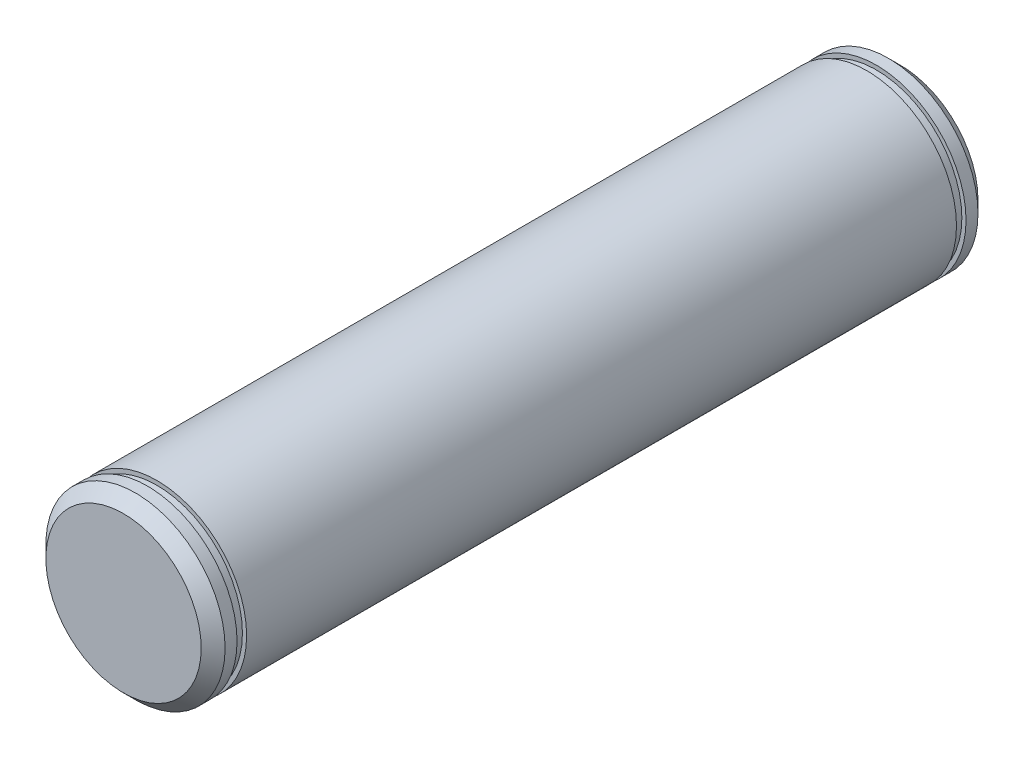
ISO-10303-21;
HEADER;
FILE_DESCRIPTION(('STEP AP214'),'2;1');
FILE_NAME('part.step','',(''),(''),'','','');
FILE_SCHEMA(('AUTOMOTIVE_DESIGN { 1 0 10303 214 1 1 1 1 }'));
ENDSEC;
DATA;
#1=APPLICATION_CONTEXT('core data for automotive mechanical design processes');
#2=APPLICATION_PROTOCOL_DEFINITION('international standard','automotive_design',2000,#1);
#3=PRODUCT_CONTEXT('',#1,'mechanical');
#4=PRODUCT('Part','Part','',(#3));
#5=PRODUCT_RELATED_PRODUCT_CATEGORY('part','',(#4));
#6=PRODUCT_DEFINITION_FORMATION('','',#4);
#7=PRODUCT_DEFINITION_CONTEXT('part definition',#1,'design');
#8=PRODUCT_DEFINITION('design','',#6,#7);
#9=PRODUCT_DEFINITION_SHAPE('','',#8);
#10=(LENGTH_UNIT() NAMED_UNIT(*) SI_UNIT(.MILLI.,.METRE.));
#11=(NAMED_UNIT(*) PLANE_ANGLE_UNIT() SI_UNIT($,.RADIAN.));
#12=(NAMED_UNIT(*) SI_UNIT($,.STERADIAN.) SOLID_ANGLE_UNIT());
#13=UNCERTAINTY_MEASURE_WITH_UNIT(LENGTH_MEASURE(1.E-05),#10,'distance_accuracy_value','');
#14=(GEOMETRIC_REPRESENTATION_CONTEXT(3) GLOBAL_UNCERTAINTY_ASSIGNED_CONTEXT((#13)) GLOBAL_UNIT_ASSIGNED_CONTEXT((#10,
#11,#12)) REPRESENTATION_CONTEXT('',''));
#15=CARTESIAN_POINT('',(0.,0.,0.));
#16=DIRECTION('',(0.,0.,1.));
#17=DIRECTION('',(1.,0.,0.));
#18=AXIS2_PLACEMENT_3D('',#15,#16,#17);
#19=CARTESIAN_POINT('',(0.,0.,130.));
#20=DIRECTION('',(0.,0.,-1.));
#21=DIRECTION('',(-1.,0.,0.));
#22=AXIS2_PLACEMENT_3D('',#19,#20,#21);
#23=CYLINDRICAL_SURFACE('',#22,15.);
#24=CARTESIAN_POINT('',(0.,0.,128.));
#25=DIRECTION('',(0.,0.,1.));
#26=DIRECTION('',(1.,0.,0.));
#27=AXIS2_PLACEMENT_3D('',#24,#25,#26);
#28=CIRCLE('',#27,15.);
#29=CARTESIAN_POINT('',(15.,0.,128.));
#30=VERTEX_POINT('',#29);
#31=EDGE_CURVE('E50',#30,#30,#28,.F.);
#32=ORIENTED_EDGE('',*,*,#31,.T.);
#33=EDGE_LOOP('',(#32));
#34=FACE_BOUND('',#33,.T.);
#35=CARTESIAN_POINT('',(0.,0.,126.));
#36=DIRECTION('',(0.,0.,1.));
#37=DIRECTION('',(1.,0.,0.));
#38=AXIS2_PLACEMENT_3D('',#35,#36,#37);
#39=CIRCLE('',#38,15.);
#40=CARTESIAN_POINT('',(15.,0.,126.));
#41=VERTEX_POINT('',#40);
#42=EDGE_CURVE('E59',#41,#41,#39,.T.);
#43=ORIENTED_EDGE('',*,*,#42,.T.);
#44=EDGE_LOOP('',(#43));
#45=FACE_BOUND('',#44,.T.);
#46=ADVANCED_FACE('F35',(#34,#45),#23,.T.);
#47=CARTESIAN_POINT('',(0.,0.,130.));
#48=DIRECTION('',(0.,0.,1.));
#49=DIRECTION('',(1.,0.,0.));
#50=AXIS2_PLACEMENT_3D('',#47,#48,#49);
#51=PLANE('',#50);
#52=CARTESIAN_POINT('',(0.,0.,130.));
#53=DIRECTION('',(0.,0.,1.));
#54=DIRECTION('',(1.,0.,0.));
#55=AXIS2_PLACEMENT_3D('',#52,#53,#54);
#56=CIRCLE('',#55,13.);
#57=CARTESIAN_POINT('',(13.,0.,130.));
#58=VERTEX_POINT('',#57);
#59=EDGE_CURVE('E10',#58,#58,#56,.T.);
#60=ORIENTED_EDGE('',*,*,#59,.T.);
#61=EDGE_LOOP('',(#60));
#62=FACE_BOUND('',#61,.T.);
#63=ADVANCED_FACE('F93',(#62),#51,.T.);
#64=CARTESIAN_POINT('',(0.,0.,130.));
#65=DIRECTION('',(0.,0.,-1.));
#66=DIRECTION('',(-1.,0.,0.));
#67=AXIS2_PLACEMENT_3D('',#64,#65,#66);
#68=CONICAL_SURFACE('',#67,13.,0.785398163397442);
#69=ORIENTED_EDGE('',*,*,#31,.F.);
#70=EDGE_LOOP('',(#69));
#71=FACE_BOUND('',#70,.T.);
#72=ORIENTED_EDGE('',*,*,#59,.F.);
#73=EDGE_LOOP('',(#72));
#74=FACE_BOUND('',#73,.T.);
#75=ADVANCED_FACE('F37',(#71,#74),#68,.T.);
#76=CARTESIAN_POINT('',(0.,15.,126.));
#77=DIRECTION('',(0.,0.,-1.));
#78=DIRECTION('',(-1.,0.,0.));
#79=AXIS2_PLACEMENT_3D('',#76,#77,#78);
#80=PLANE('',#79);
#81=CARTESIAN_POINT('',(0.,0.,126.));
#82=DIRECTION('',(0.,0.,1.));
#83=DIRECTION('',(1.,0.,0.));
#84=AXIS2_PLACEMENT_3D('',#81,#82,#83);
#85=CIRCLE('',#84,14.3);
#86=CARTESIAN_POINT('',(14.3,0.,126.));
#87=VERTEX_POINT('',#86);
#88=EDGE_CURVE('E55',#87,#87,#85,.T.);
#89=ORIENTED_EDGE('',*,*,#88,.T.);
#90=EDGE_LOOP('',(#89));
#91=FACE_BOUND('',#90,.T.);
#92=ORIENTED_EDGE('',*,*,#42,.F.);
#93=EDGE_LOOP('',(#92));
#94=FACE_BOUND('',#93,.T.);
#95=ADVANCED_FACE('F81',(#91,#94),#80,.T.);
#96=CARTESIAN_POINT('',(0.,0.,130.));
#97=DIRECTION('',(0.,0.,1.));
#98=DIRECTION('',(1.,0.,0.));
#99=AXIS2_PLACEMENT_3D('',#96,#97,#98);
#100=CYLINDRICAL_SURFACE('',#99,14.3);
#101=CARTESIAN_POINT('',(0.,0.,124.4));
#102=DIRECTION('',(0.,0.,1.));
#103=DIRECTION('',(1.,0.,0.));
#104=AXIS2_PLACEMENT_3D('',#101,#102,#103);
#105=CIRCLE('',#104,14.3);
#106=CARTESIAN_POINT('',(14.3,0.,124.4));
#107=VERTEX_POINT('',#106);
#108=EDGE_CURVE('E71',#107,#107,#105,.T.);
#109=ORIENTED_EDGE('',*,*,#108,.T.);
#110=EDGE_LOOP('',(#109));
#111=FACE_BOUND('',#110,.T.);
#112=ORIENTED_EDGE('',*,*,#88,.F.);
#113=EDGE_LOOP('',(#112));
#114=FACE_BOUND('',#113,.T.);
#115=ADVANCED_FACE('F83',(#111,#114),#100,.T.);
#116=CARTESIAN_POINT('',(0.,15.,124.4));
#117=DIRECTION('',(0.,0.,1.));
#118=DIRECTION('',(1.,0.,0.));
#119=AXIS2_PLACEMENT_3D('',#116,#117,#118);
#120=PLANE('',#119);
#121=CARTESIAN_POINT('',(0.,0.,124.4));
#122=DIRECTION('',(0.,0.,1.));
#123=DIRECTION('',(1.,0.,0.));
#124=AXIS2_PLACEMENT_3D('',#121,#122,#123);
#125=CIRCLE('',#124,15.);
#126=CARTESIAN_POINT('',(15.,0.,124.4));
#127=VERTEX_POINT('',#126);
#128=EDGE_CURVE('E74',#127,#127,#125,.T.);
#129=ORIENTED_EDGE('',*,*,#128,.T.);
#130=EDGE_LOOP('',(#129));
#131=FACE_BOUND('',#130,.T.);
#132=ORIENTED_EDGE('',*,*,#108,.F.);
#133=EDGE_LOOP('',(#132));
#134=FACE_BOUND('',#133,.T.);
#135=ADVANCED_FACE('F90',(#131,#134),#120,.T.);
#136=CARTESIAN_POINT('',(0.,0.,5.59999999999999));
#137=DIRECTION('',(0.,0.,1.));
#138=DIRECTION('',(1.,0.,0.));
#139=AXIS2_PLACEMENT_3D('',#136,#137,#138);
#140=CIRCLE('',#139,15.);
#141=CARTESIAN_POINT('',(15.,0.,5.59999999999999));
#142=VERTEX_POINT('',#141);
#143=EDGE_CURVE('E66',#142,#142,#140,.T.);
#144=ORIENTED_EDGE('',*,*,#143,.T.);
#145=EDGE_LOOP('',(#144));
#146=FACE_BOUND('',#145,.T.);
#147=ORIENTED_EDGE('',*,*,#128,.F.);
#148=EDGE_LOOP('',(#147));
#149=FACE_BOUND('',#148,.T.);
#150=ADVANCED_FACE('F99',(#146,#149),#23,.T.);
#151=CARTESIAN_POINT('',(0.,15.,5.6));
#152=DIRECTION('',(0.,0.,-1.));
#153=DIRECTION('',(-1.,0.,0.));
#154=AXIS2_PLACEMENT_3D('',#151,#152,#153);
#155=PLANE('',#154);
#156=CARTESIAN_POINT('',(0.,0.,5.59999999999999));
#157=DIRECTION('',(0.,0.,1.));
#158=DIRECTION('',(1.,0.,0.));
#159=AXIS2_PLACEMENT_3D('',#156,#157,#158);
#160=CIRCLE('',#159,14.3);
#161=CARTESIAN_POINT('',(14.3,0.,5.59999999999999));
#162=VERTEX_POINT('',#161);
#163=EDGE_CURVE('E56',#162,#162,#160,.T.);
#164=ORIENTED_EDGE('',*,*,#163,.T.);
#165=EDGE_LOOP('',(#164));
#166=FACE_BOUND('',#165,.T.);
#167=ORIENTED_EDGE('',*,*,#143,.F.);
#168=EDGE_LOOP('',(#167));
#169=FACE_BOUND('',#168,.T.);
#170=ADVANCED_FACE('F107',(#166,#169),#155,.T.);
#171=CARTESIAN_POINT('',(0.,0.,130.));
#172=DIRECTION('',(0.,0.,1.));
#173=DIRECTION('',(1.,0.,0.));
#174=AXIS2_PLACEMENT_3D('',#171,#172,#173);
#175=CYLINDRICAL_SURFACE('',#174,14.3);
#176=CARTESIAN_POINT('',(0.,0.,4.));
#177=DIRECTION('',(0.,0.,1.));
#178=DIRECTION('',(1.,0.,0.));
#179=AXIS2_PLACEMENT_3D('',#176,#177,#178);
#180=CIRCLE('',#179,14.3);
#181=CARTESIAN_POINT('',(14.3,0.,4.));
#182=VERTEX_POINT('',#181);
#183=EDGE_CURVE('E60',#182,#182,#180,.T.);
#184=ORIENTED_EDGE('',*,*,#183,.T.);
#185=EDGE_LOOP('',(#184));
#186=FACE_BOUND('',#185,.T.);
#187=ORIENTED_EDGE('',*,*,#163,.F.);
#188=EDGE_LOOP('',(#187));
#189=FACE_BOUND('',#188,.T.);
#190=ADVANCED_FACE('F124',(#186,#189),#175,.T.);
#191=CARTESIAN_POINT('',(0.,15.,4.));
#192=DIRECTION('',(0.,0.,1.));
#193=DIRECTION('',(1.,0.,0.));
#194=AXIS2_PLACEMENT_3D('',#191,#192,#193);
#195=PLANE('',#194);
#196=CARTESIAN_POINT('',(0.,0.,4.));
#197=DIRECTION('',(0.,0.,1.));
#198=DIRECTION('',(1.,0.,0.));
#199=AXIS2_PLACEMENT_3D('',#196,#197,#198);
#200=CIRCLE('',#199,15.);
#201=CARTESIAN_POINT('',(15.,0.,4.));
#202=VERTEX_POINT('',#201);
#203=EDGE_CURVE('E63',#202,#202,#200,.T.);
#204=ORIENTED_EDGE('',*,*,#203,.T.);
#205=EDGE_LOOP('',(#204));
#206=FACE_BOUND('',#205,.T.);
#207=ORIENTED_EDGE('',*,*,#183,.F.);
#208=EDGE_LOOP('',(#207));
#209=FACE_BOUND('',#208,.T.);
#210=ADVANCED_FACE('F121',(#206,#209),#195,.T.);
#211=CARTESIAN_POINT('',(0.,0.,0.));
#212=DIRECTION('',(0.,0.,1.));
#213=DIRECTION('',(1.,0.,0.));
#214=AXIS2_PLACEMENT_3D('',#211,#212,#213);
#215=PLANE('',#214);
#216=CARTESIAN_POINT('',(0.,0.,0.));
#217=DIRECTION('',(0.,0.,1.));
#218=DIRECTION('',(1.,0.,0.));
#219=AXIS2_PLACEMENT_3D('',#216,#217,#218);
#220=CIRCLE('',#219,13.);
#221=CARTESIAN_POINT('',(13.,0.,0.));
#222=VERTEX_POINT('',#221);
#223=EDGE_CURVE('E42',#222,#222,#220,.F.);
#224=ORIENTED_EDGE('',*,*,#223,.T.);
#225=EDGE_LOOP('',(#224));
#226=FACE_BOUND('',#225,.T.);
#227=ADVANCED_FACE('F115',(#226),#215,.F.);
#228=CARTESIAN_POINT('',(0.,0.,2.00000000000003));
#229=DIRECTION('',(0.,0.,1.));
#230=DIRECTION('',(1.,0.,0.));
#231=AXIS2_PLACEMENT_3D('',#228,#229,#230);
#232=CONICAL_SURFACE('',#231,15.,0.785398163397445);
#233=ORIENTED_EDGE('',*,*,#223,.F.);
#234=EDGE_LOOP('',(#233));
#235=FACE_BOUND('',#234,.T.);
#236=CARTESIAN_POINT('',(0.,0.,2.00000000000003));
#237=DIRECTION('',(0.,0.,1.));
#238=DIRECTION('',(1.,0.,0.));
#239=AXIS2_PLACEMENT_3D('',#236,#237,#238);
#240=CIRCLE('',#239,15.);
#241=CARTESIAN_POINT('',(15.,0.,2.00000000000003));
#242=VERTEX_POINT('',#241);
#243=EDGE_CURVE('E46',#242,#242,#240,.T.);
#244=ORIENTED_EDGE('',*,*,#243,.F.);
#245=EDGE_LOOP('',(#244));
#246=FACE_BOUND('',#245,.T.);
#247=ADVANCED_FACE('F110',(#235,#246),#232,.T.);
#248=ORIENTED_EDGE('',*,*,#243,.T.);
#249=EDGE_LOOP('',(#248));
#250=FACE_BOUND('',#249,.T.);
#251=ORIENTED_EDGE('',*,*,#203,.F.);
#252=EDGE_LOOP('',(#251));
#253=FACE_BOUND('',#252,.T.);
#254=ADVANCED_FACE('F100',(#250,#253),#23,.T.);
#255=CLOSED_SHELL('',(#46,#63,#75,#95,#115,#135,#150,#170,#190,#210,#227,#247,#254));
#256=MANIFOLD_SOLID_BREP('B2',#255);
#257=ADVANCED_BREP_SHAPE_REPRESENTATION('',(#18,#256),#14);
#258=SHAPE_DEFINITION_REPRESENTATION(#9,#257);
ENDSEC;
END-ISO-10303-21;
